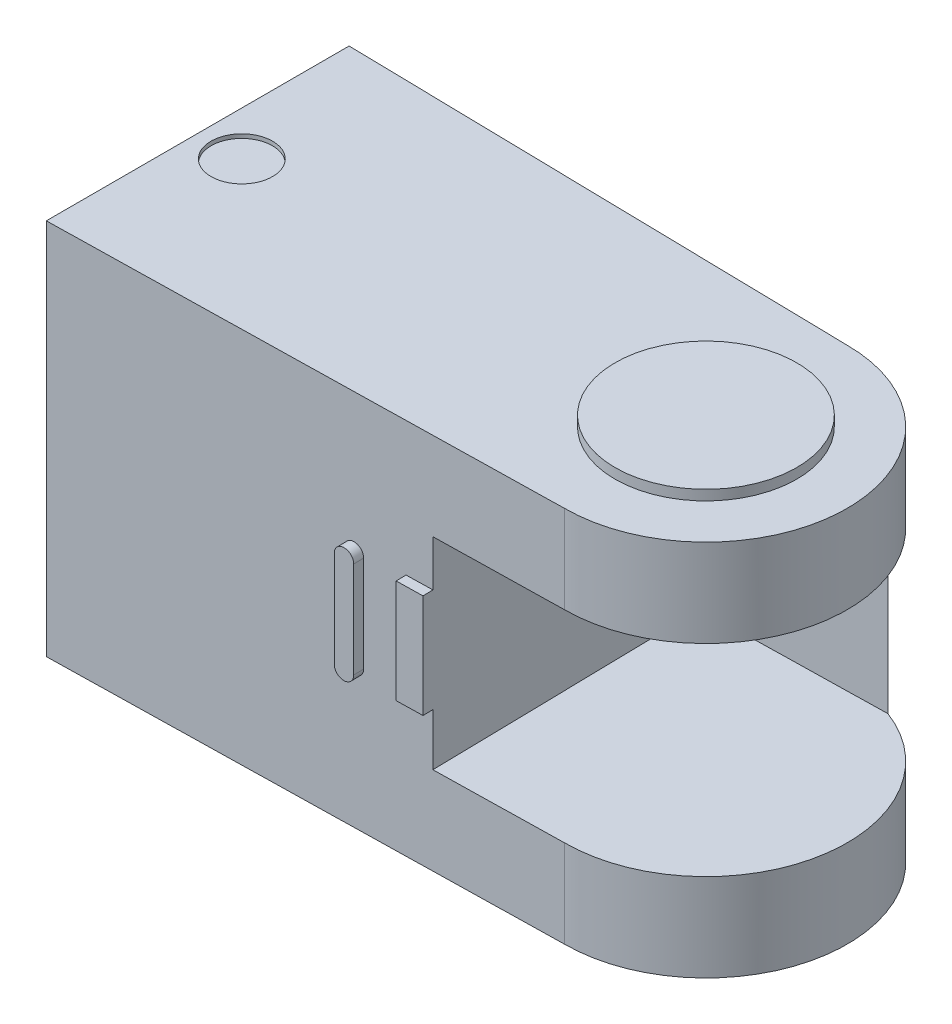
ISO-10303-21;
HEADER;
FILE_DESCRIPTION(('STEP AP214'),'2;1');
FILE_NAME('part.step','',(''),(''),'','','');
FILE_SCHEMA(('AUTOMOTIVE_DESIGN { 1 0 10303 214 1 1 1 1 }'));
ENDSEC;
DATA;
#1=APPLICATION_CONTEXT('core data for automotive mechanical design processes');
#2=APPLICATION_PROTOCOL_DEFINITION('international standard','automotive_design',2000,#1);
#3=PRODUCT_CONTEXT('',#1,'mechanical');
#4=PRODUCT('Part','Part','',(#3));
#5=PRODUCT_RELATED_PRODUCT_CATEGORY('part','',(#4));
#6=PRODUCT_DEFINITION_FORMATION('','',#4);
#7=PRODUCT_DEFINITION_CONTEXT('part definition',#1,'design');
#8=PRODUCT_DEFINITION('design','',#6,#7);
#9=PRODUCT_DEFINITION_SHAPE('','',#8);
#10=(LENGTH_UNIT() NAMED_UNIT(*) SI_UNIT(.MILLI.,.METRE.));
#11=(NAMED_UNIT(*) PLANE_ANGLE_UNIT() SI_UNIT($,.RADIAN.));
#12=(NAMED_UNIT(*) SI_UNIT($,.STERADIAN.) SOLID_ANGLE_UNIT());
#13=UNCERTAINTY_MEASURE_WITH_UNIT(LENGTH_MEASURE(1.E-05),#10,'distance_accuracy_value','');
#14=(GEOMETRIC_REPRESENTATION_CONTEXT(3) GLOBAL_UNCERTAINTY_ASSIGNED_CONTEXT((#13)) GLOBAL_UNIT_ASSIGNED_CONTEXT((#10,
#11,#12)) REPRESENTATION_CONTEXT('',''));
#15=CARTESIAN_POINT('',(0.,0.,0.));
#16=DIRECTION('',(0.,0.,1.));
#17=DIRECTION('',(1.,0.,0.));
#18=AXIS2_PLACEMENT_3D('',#15,#16,#17);
#19=CARTESIAN_POINT('',(-251.76912568306,-187.,75.));
#20=DIRECTION('',(0.0198555493338502,0.,0.999802859148068));
#21=DIRECTION('',(0.999802859148068,0.,-0.0198555493338502));
#22=AXIS2_PLACEMENT_3D('',#19,#20,#21);
#23=PLANE('',#22);
#24=DIRECTION('',(0.,-1.,0.));
#25=VECTOR('',#24,1.);
#26=CARTESIAN_POINT('',(-77.0365294327965,-117.689052856582,71.5299042172823));
#27=LINE('',#26,#25);
#28=CARTESIAN_POINT('',(-77.0365294327965,-66.3433688904558,71.5299042172823));
#29=VERTEX_POINT('',#28);
#30=CARTESIAN_POINT('',(-77.0365294327965,-117.689052856582,71.5299042172823));
#31=VERTEX_POINT('',#30);
#32=EDGE_CURVE('E179',#29,#31,#27,.T.);
#33=ORIENTED_EDGE('',*,*,#32,.F.);
#34=DIRECTION('',(-0.999802859148068,0.,0.01985554933385));
#35=VECTOR('',#34,1.);
#36=CARTESIAN_POINT('',(-63.9873829854763,-66.3433688904558,71.2707551573665));
#37=LINE('',#36,#35);
#38=CARTESIAN_POINT('',(-63.9873829854763,-66.3433688904558,71.2707551573665));
#39=VERTEX_POINT('',#38);
#40=EDGE_CURVE('E177',#39,#29,#37,.T.);
#41=ORIENTED_EDGE('',*,*,#40,.F.);
#42=DIRECTION('',(0.,-1.,0.));
#43=VECTOR('',#42,1.);
#44=CARTESIAN_POINT('',(-63.9873829854763,-43.5,71.2707551573665));
#45=LINE('',#44,#43);
#46=CARTESIAN_POINT('',(-63.9873829854763,-43.5,71.2707551573664));
#47=VERTEX_POINT('',#46);
#48=EDGE_CURVE('E225',#47,#39,#45,.T.);
#49=ORIENTED_EDGE('',*,*,#48,.F.);
#50=DIRECTION('',(-0.999802859148068,0.,0.0198555493338502));
#51=VECTOR('',#50,1.);
#52=CARTESIAN_POINT('',(-251.76912568306,-43.5,75.));
#53=LINE('',#52,#51);
#54=CARTESIAN_POINT('',(0.,-43.5,70.));
#55=VERTEX_POINT('',#54);
#56=EDGE_CURVE('E266',#55,#47,#53,.T.);
#57=ORIENTED_EDGE('',*,*,#56,.F.);
#58=DIRECTION('',(0.,1.,0.));
#59=VECTOR('',#58,1.);
#60=CARTESIAN_POINT('',(0.,-187.,70.));
#61=LINE('',#60,#59);
#62=CARTESIAN_POINT('',(0.,0.,70.));
#63=VERTEX_POINT('',#62);
#64=EDGE_CURVE('E267',#55,#63,#61,.T.);
#65=ORIENTED_EDGE('',*,*,#64,.T.);
#66=DIRECTION('',(0.999802859148068,0.,-0.0198555493338502));
#67=VECTOR('',#66,1.);
#68=CARTESIAN_POINT('',(-251.76912568306,0.,75.));
#69=LINE('',#68,#67);
#70=CARTESIAN_POINT('',(-251.76912568306,0.,75.));
#71=VERTEX_POINT('',#70);
#72=EDGE_CURVE('E243',#71,#63,#69,.T.);
#73=ORIENTED_EDGE('',*,*,#72,.F.);
#74=DIRECTION('',(0.,1.,0.));
#75=VECTOR('',#74,1.);
#76=CARTESIAN_POINT('',(-251.76912568306,-187.,75.));
#77=LINE('',#76,#75);
#78=CARTESIAN_POINT('',(-251.76912568306,-187.,75.));
#79=VERTEX_POINT('',#78);
#80=EDGE_CURVE('E268',#79,#71,#77,.T.);
#81=ORIENTED_EDGE('',*,*,#80,.F.);
#82=DIRECTION('',(0.999802859148068,0.,-0.0198555493338502));
#83=VECTOR('',#82,1.);
#84=CARTESIAN_POINT('',(-251.76912568306,-187.,75.));
#85=LINE('',#84,#83);
#86=CARTESIAN_POINT('',(0.,-187.,70.));
#87=VERTEX_POINT('',#86);
#88=EDGE_CURVE('E249',#79,#87,#85,.T.);
#89=ORIENTED_EDGE('',*,*,#88,.T.);
#90=CARTESIAN_POINT('',(0.,-143.5,70.));
#91=VERTEX_POINT('',#90);
#92=EDGE_CURVE('E263',#87,#91,#61,.T.);
#93=ORIENTED_EDGE('',*,*,#92,.T.);
#94=DIRECTION('',(0.999802859148068,0.,-0.0198555493338502));
#95=VECTOR('',#94,1.);
#96=CARTESIAN_POINT('',(170.633265180487,-143.5,66.6113147369132));
#97=LINE('',#96,#95);
#98=CARTESIAN_POINT('',(-63.9873829854763,-143.5,71.2707551573665));
#99=VERTEX_POINT('',#98);
#100=EDGE_CURVE('E218',#99,#91,#97,.T.);
#101=ORIENTED_EDGE('',*,*,#100,.F.);
#102=CARTESIAN_POINT('',(-63.9873829854763,-117.689052856582,71.2707551573665));
#103=VERTEX_POINT('',#102);
#104=EDGE_CURVE('E212',#103,#99,#45,.T.);
#105=ORIENTED_EDGE('',*,*,#104,.F.);
#106=DIRECTION('',(0.999802859148068,0.,-0.01985554933385));
#107=VECTOR('',#106,1.);
#108=CARTESIAN_POINT('',(-63.9873829854763,-117.689052856582,71.2707551573665));
#109=LINE('',#108,#107);
#110=EDGE_CURVE('E188',#31,#103,#109,.T.);
#111=ORIENTED_EDGE('',*,*,#110,.F.);
#112=EDGE_LOOP('',(#33,#41,#49,#57,#65,#73,#81,#89,#93,#101,#105,#111));
#113=FACE_BOUND('',#112,.T.);
#114=DIRECTION('',(0.,1.,0.));
#115=VECTOR('',#114,1.);
#116=CARTESIAN_POINT('',(-97.6313826815124,-116.79953134356,71.9389069731373));
#117=LINE('',#116,#115);
#118=CARTESIAN_POINT('',(-97.6313826815124,-116.79953134356,71.9389069731373));
#119=VERTEX_POINT('',#118);
#120=CARTESIAN_POINT('',(-97.6313826815124,-69.1725088953774,71.9389069731373));
#121=VERTEX_POINT('',#120);
#122=EDGE_CURVE('E493',#119,#121,#117,.T.);
#123=ORIENTED_EDGE('',*,*,#122,.F.);
#124=CARTESIAN_POINT('',(-102.364306679185,-116.79953134356,72.0329003089928));
#125=DIRECTION('',(0.0198555493338503,0.,0.999802859148068));
#126=DIRECTION('',(0.999802859148068,0.,-0.0198555493338503));
#127=AXIS2_PLACEMENT_3D('',#124,#125,#126);
#128=CIRCLE('',#127,4.73385723432074);
#129=CARTESIAN_POINT('',(-107.097230676858,-116.79953134356,72.1268936448482));
#130=VERTEX_POINT('',#129);
#131=EDGE_CURVE('E175',#130,#119,#128,.T.);
#132=ORIENTED_EDGE('',*,*,#131,.F.);
#133=DIRECTION('',(0.,-1.,0.));
#134=VECTOR('',#133,1.);
#135=CARTESIAN_POINT('',(-107.097230676858,-116.79953134356,72.1268936448482));
#136=LINE('',#135,#134);
#137=CARTESIAN_POINT('',(-107.097230676858,-69.1725088953774,72.1268936448482));
#138=VERTEX_POINT('',#137);
#139=EDGE_CURVE('E171',#138,#130,#136,.T.);
#140=ORIENTED_EDGE('',*,*,#139,.F.);
#141=CARTESIAN_POINT('',(-102.364306679185,-69.1725088953774,72.0329003089928));
#142=DIRECTION('',(0.0198555493338503,0.,0.999802859148068));
#143=DIRECTION('',(0.999802859148068,0.,-0.0198555493338503));
#144=AXIS2_PLACEMENT_3D('',#141,#142,#143);
#145=CIRCLE('',#144,4.73385723432074);
#146=EDGE_CURVE('E502',#121,#138,#145,.T.);
#147=ORIENTED_EDGE('',*,*,#146,.F.);
#148=EDGE_LOOP('',(#123,#132,#140,#147));
#149=FACE_BOUND('',#148,.T.);
#150=ADVANCED_FACE('F38',(#113,#149),#23,.T.);
#151=CARTESIAN_POINT('',(0.,-187.,0.));
#152=DIRECTION('',(0.,1.,0.));
#153=DIRECTION('',(0.,0.,1.));
#154=AXIS2_PLACEMENT_3D('',#151,#152,#153);
#155=CYLINDRICAL_SURFACE('',#154,70.);
#156=CARTESIAN_POINT('',(0.,-143.5,0.));
#157=DIRECTION('',(0.,-1.,0.));
#158=DIRECTION('',(0.,0.,-1.));
#159=AXIS2_PLACEMENT_3D('',#156,#157,#158);
#160=CIRCLE('',#159,70.);
#161=CARTESIAN_POINT('',(24.6502105099139,-143.5,-65.5161592419529));
#162=VERTEX_POINT('',#161);
#163=EDGE_CURVE('E233',#91,#162,#160,.F.);
#164=ORIENTED_EDGE('',*,*,#163,.F.);
#165=ORIENTED_EDGE('',*,*,#92,.F.);
#166=CARTESIAN_POINT('',(0.,-187.,0.));
#167=DIRECTION('',(0.,1.,0.));
#168=DIRECTION('',(0.,0.,1.));
#169=AXIS2_PLACEMENT_3D('',#166,#167,#168);
#170=CIRCLE('',#169,70.);
#171=CARTESIAN_POINT('',(0.,-187.,-70.));
#172=VERTEX_POINT('',#171);
#173=EDGE_CURVE('E239',#87,#172,#170,.T.);
#174=ORIENTED_EDGE('',*,*,#173,.T.);
#175=DIRECTION('',(0.,1.,0.));
#176=VECTOR('',#175,1.);
#177=CARTESIAN_POINT('',(0.,-187.,-70.));
#178=LINE('',#177,#176);
#179=CARTESIAN_POINT('',(0.,0.,-70.));
#180=VERTEX_POINT('',#179);
#181=EDGE_CURVE('E252',#172,#180,#178,.T.);
#182=ORIENTED_EDGE('',*,*,#181,.T.);
#183=CARTESIAN_POINT('',(0.,0.,0.));
#184=DIRECTION('',(0.,1.,0.));
#185=DIRECTION('',(0.,0.,1.));
#186=AXIS2_PLACEMENT_3D('',#183,#184,#185);
#187=CIRCLE('',#186,70.);
#188=EDGE_CURVE('E238',#63,#180,#187,.T.);
#189=ORIENTED_EDGE('',*,*,#188,.F.);
#190=ORIENTED_EDGE('',*,*,#64,.F.);
#191=CARTESIAN_POINT('',(0.,-43.5,0.));
#192=DIRECTION('',(0.,1.,0.));
#193=DIRECTION('',(0.,0.,1.));
#194=AXIS2_PLACEMENT_3D('',#191,#192,#193);
#195=CIRCLE('',#194,70.);
#196=CARTESIAN_POINT('',(24.6502105099139,-43.5,-65.5161592419529));
#197=VERTEX_POINT('',#196);
#198=EDGE_CURVE('E236',#197,#55,#195,.F.);
#199=ORIENTED_EDGE('',*,*,#198,.F.);
#200=DIRECTION('',(0.,1.,0.));
#201=VECTOR('',#200,1.);
#202=CARTESIAN_POINT('',(24.6502105099139,-187.,-65.5161592419529));
#203=LINE('',#202,#201);
#204=EDGE_CURVE('E46',#197,#162,#203,.F.);
#205=ORIENTED_EDGE('',*,*,#204,.T.);
#206=EDGE_LOOP('',(#164,#165,#174,#182,#189,#190,#199,#205));
#207=FACE_BOUND('',#206,.T.);
#208=ADVANCED_FACE('F40',(#207),#155,.T.);
#209=CARTESIAN_POINT('',(-251.76912568306,-187.,-75.));
#210=DIRECTION('',(-1.,0.,0.));
#211=DIRECTION('',(0.,0.,1.));
#212=AXIS2_PLACEMENT_3D('',#209,#210,#211);
#213=PLANE('',#212);
#214=DIRECTION('',(0.,0.,1.));
#215=VECTOR('',#214,1.);
#216=CARTESIAN_POINT('',(-251.76912568306,0.,-75.));
#217=LINE('',#216,#215);
#218=CARTESIAN_POINT('',(-251.76912568306,0.,-75.));
#219=VERTEX_POINT('',#218);
#220=EDGE_CURVE('E258',#219,#71,#217,.T.);
#221=ORIENTED_EDGE('',*,*,#220,.F.);
#222=DIRECTION('',(0.,1.,0.));
#223=VECTOR('',#222,1.);
#224=CARTESIAN_POINT('',(-251.76912568306,-187.,-75.));
#225=LINE('',#224,#223);
#226=CARTESIAN_POINT('',(-251.76912568306,-187.,-75.));
#227=VERTEX_POINT('',#226);
#228=EDGE_CURVE('E270',#227,#219,#225,.T.);
#229=ORIENTED_EDGE('',*,*,#228,.F.);
#230=DIRECTION('',(0.,0.,1.));
#231=VECTOR('',#230,1.);
#232=CARTESIAN_POINT('',(-251.76912568306,-187.,-75.));
#233=LINE('',#232,#231);
#234=EDGE_CURVE('E246',#227,#79,#233,.T.);
#235=ORIENTED_EDGE('',*,*,#234,.T.);
#236=ORIENTED_EDGE('',*,*,#80,.T.);
#237=EDGE_LOOP('',(#221,#229,#235,#236));
#238=FACE_BOUND('',#237,.T.);
#239=ADVANCED_FACE('F339',(#238),#213,.T.);
#240=CARTESIAN_POINT('',(0.,-187.,-70.));
#241=DIRECTION('',(0.01985554933385,0.,-0.999802859148068));
#242=DIRECTION('',(-0.999802859148068,0.,-0.01985554933385));
#243=AXIS2_PLACEMENT_3D('',#240,#241,#242);
#244=PLANE('',#243);
#245=DIRECTION('',(-0.999802859148068,0.,-0.01985554933385));
#246=VECTOR('',#245,1.);
#247=CARTESIAN_POINT('',(0.,0.,-70.));
#248=LINE('',#247,#246);
#249=EDGE_CURVE('E255',#180,#219,#248,.T.);
#250=ORIENTED_EDGE('',*,*,#249,.F.);
#251=ORIENTED_EDGE('',*,*,#181,.F.);
#252=DIRECTION('',(-0.999802859148068,0.,-0.01985554933385));
#253=VECTOR('',#252,1.);
#254=CARTESIAN_POINT('',(0.,-187.,-70.));
#255=LINE('',#254,#253);
#256=EDGE_CURVE('E242',#172,#227,#255,.T.);
#257=ORIENTED_EDGE('',*,*,#256,.T.);
#258=ORIENTED_EDGE('',*,*,#228,.T.);
#259=EDGE_LOOP('',(#250,#251,#257,#258));
#260=FACE_BOUND('',#259,.T.);
#261=ADVANCED_FACE('F304',(#260),#244,.T.);
#262=CARTESIAN_POINT('',(0.,-187.,0.));
#263=DIRECTION('',(0.,1.,0.));
#264=DIRECTION('',(0.,0.,1.));
#265=AXIS2_PLACEMENT_3D('',#262,#263,#264);
#266=PLANE('',#265);
#267=CARTESIAN_POINT('',(0.,-187.,0.));
#268=DIRECTION('',(0.,1.,0.));
#269=DIRECTION('',(0.,0.,1.));
#270=AXIS2_PLACEMENT_3D('',#267,#268,#269);
#271=CIRCLE('',#270,45.);
#272=CARTESIAN_POINT('',(0.,-187.,45.));
#273=VERTEX_POINT('',#272);
#274=EDGE_CURVE('E11',#273,#273,#271,.F.);
#275=ORIENTED_EDGE('',*,*,#274,.F.);
#276=EDGE_LOOP('',(#275));
#277=FACE_BOUND('',#276,.T.);
#278=ORIENTED_EDGE('',*,*,#173,.F.);
#279=ORIENTED_EDGE('',*,*,#88,.F.);
#280=ORIENTED_EDGE('',*,*,#234,.F.);
#281=ORIENTED_EDGE('',*,*,#256,.F.);
#282=EDGE_LOOP('',(#278,#279,#280,#281));
#283=FACE_BOUND('',#282,.T.);
#284=ADVANCED_FACE('F300',(#277,#283),#266,.F.);
#285=CARTESIAN_POINT('',(0.,0.,0.));
#286=DIRECTION('',(0.,1.,0.));
#287=DIRECTION('',(0.,0.,1.));
#288=AXIS2_PLACEMENT_3D('',#285,#286,#287);
#289=PLANE('',#288);
#290=CARTESIAN_POINT('',(-229.928260901961,0.,0.));
#291=DIRECTION('',(0.,1.,0.));
#292=DIRECTION('',(0.,0.,1.));
#293=AXIS2_PLACEMENT_3D('',#290,#291,#292);
#294=CIRCLE('',#293,15.225);
#295=CARTESIAN_POINT('',(-229.928260901961,0.,15.225));
#296=VERTEX_POINT('',#295);
#297=EDGE_CURVE('E491',#296,#296,#294,.T.);
#298=ORIENTED_EDGE('',*,*,#297,.F.);
#299=EDGE_LOOP('',(#298));
#300=FACE_BOUND('',#299,.T.);
#301=CARTESIAN_POINT('',(0.,0.,0.));
#302=DIRECTION('',(0.,1.,0.));
#303=DIRECTION('',(0.,0.,1.));
#304=AXIS2_PLACEMENT_3D('',#301,#302,#303);
#305=CIRCLE('',#304,45.);
#306=CARTESIAN_POINT('',(0.,0.,45.));
#307=VERTEX_POINT('',#306);
#308=EDGE_CURVE('E208',#307,#307,#305,.T.);
#309=ORIENTED_EDGE('',*,*,#308,.F.);
#310=EDGE_LOOP('',(#309));
#311=FACE_BOUND('',#310,.T.);
#312=ORIENTED_EDGE('',*,*,#188,.T.);
#313=ORIENTED_EDGE('',*,*,#249,.T.);
#314=ORIENTED_EDGE('',*,*,#220,.T.);
#315=ORIENTED_EDGE('',*,*,#72,.T.);
#316=EDGE_LOOP('',(#312,#313,#314,#315));
#317=FACE_BOUND('',#316,.T.);
#318=ADVANCED_FACE('F309',(#300,#311,#317),#289,.T.);
#319=CARTESIAN_POINT('',(-2.68049916006978,-43.5,-64.9733859849891));
#320=DIRECTION('',(0.,1.,0.));
#321=DIRECTION('',(0.,0.,1.));
#322=AXIS2_PLACEMENT_3D('',#319,#320,#321);
#323=PLANE('',#322);
#324=ORIENTED_EDGE('',*,*,#198,.T.);
#325=ORIENTED_EDGE('',*,*,#56,.T.);
#326=DIRECTION('',(0.0198555493338503,0.,0.999802859148068));
#327=VECTOR('',#326,1.);
#328=CARTESIAN_POINT('',(-66.6678821455461,-43.5,-63.7026308276227));
#329=LINE('',#328,#327);
#330=CARTESIAN_POINT('',(-66.6678821455461,-43.5,-63.7026308276227));
#331=VERTEX_POINT('',#330);
#332=EDGE_CURVE('E224',#331,#47,#329,.T.);
#333=ORIENTED_EDGE('',*,*,#332,.F.);
#334=DIRECTION('',(-0.999802859148068,0.,0.0198555493338502));
#335=VECTOR('',#334,1.);
#336=CARTESIAN_POINT('',(-2.68049916006978,-43.5,-64.9733859849891));
#337=LINE('',#336,#335);
#338=EDGE_CURVE('E215',#197,#331,#337,.T.);
#339=ORIENTED_EDGE('',*,*,#338,.F.);
#340=EDGE_LOOP('',(#324,#325,#333,#339));
#341=FACE_BOUND('',#340,.T.);
#342=ADVANCED_FACE('F284',(#341),#323,.F.);
#343=CARTESIAN_POINT('',(167.952766020417,-143.5,-68.3620712480759));
#344=DIRECTION('',(0.,-1.,0.));
#345=DIRECTION('',(0.,0.,-1.));
#346=AXIS2_PLACEMENT_3D('',#343,#344,#345);
#347=PLANE('',#346);
#348=ORIENTED_EDGE('',*,*,#163,.T.);
#349=DIRECTION('',(0.999802859148068,0.,-0.0198555493338502));
#350=VECTOR('',#349,1.);
#351=CARTESIAN_POINT('',(-2.68049916006977,-143.5,-64.9733859849891));
#352=LINE('',#351,#350);
#353=CARTESIAN_POINT('',(-66.6678821455461,-143.5,-63.7026308276227));
#354=VERTEX_POINT('',#353);
#355=EDGE_CURVE('E221',#354,#162,#352,.T.);
#356=ORIENTED_EDGE('',*,*,#355,.F.);
#357=DIRECTION('',(0.0198555493338503,0.,0.999802859148068));
#358=VECTOR('',#357,1.);
#359=CARTESIAN_POINT('',(-66.6678821455461,-143.5,-63.7026308276227));
#360=LINE('',#359,#358);
#361=EDGE_CURVE('E230',#354,#99,#360,.T.);
#362=ORIENTED_EDGE('',*,*,#361,.T.);
#363=ORIENTED_EDGE('',*,*,#100,.T.);
#364=EDGE_LOOP('',(#348,#356,#362,#363));
#365=FACE_BOUND('',#364,.T.);
#366=ADVANCED_FACE('F292',(#365),#347,.F.);
#367=CARTESIAN_POINT('',(-66.6678821455461,-43.5,-63.7026308276227));
#368=DIRECTION('',(-0.999802859148068,0.,0.0198555493338503));
#369=DIRECTION('',(0.0198555493338503,0.,0.999802859148068));
#370=AXIS2_PLACEMENT_3D('',#367,#368,#369);
#371=PLANE('',#370);
#372=ORIENTED_EDGE('',*,*,#48,.T.);
#373=DIRECTION('',(-0.0198555493338502,0.,-0.999802859148068));
#374=VECTOR('',#373,1.);
#375=CARTESIAN_POINT('',(-63.888105238807,-66.3433688904558,76.2697694531068));
#376=LINE('',#375,#374);
#377=CARTESIAN_POINT('',(-63.888105238807,-66.3433688904558,76.2697694531068));
#378=VERTEX_POINT('',#377);
#379=EDGE_CURVE('E203',#378,#39,#376,.T.);
#380=ORIENTED_EDGE('',*,*,#379,.F.);
#381=DIRECTION('',(0.,1.,0.));
#382=VECTOR('',#381,1.);
#383=CARTESIAN_POINT('',(-63.888105238807,-117.689052856582,76.2697694531068));
#384=LINE('',#383,#382);
#385=CARTESIAN_POINT('',(-63.888105238807,-117.689052856582,76.2697694531068));
#386=VERTEX_POINT('',#385);
#387=EDGE_CURVE('E184',#386,#378,#384,.T.);
#388=ORIENTED_EDGE('',*,*,#387,.F.);
#389=DIRECTION('',(-0.0198555493338502,0.,-0.999802859148068));
#390=VECTOR('',#389,1.);
#391=CARTESIAN_POINT('',(-63.888105238807,-117.689052856582,76.2697694531068));
#392=LINE('',#391,#390);
#393=EDGE_CURVE('E61',#386,#103,#392,.T.);
#394=ORIENTED_EDGE('',*,*,#393,.T.);
#395=ORIENTED_EDGE('',*,*,#104,.T.);
#396=ORIENTED_EDGE('',*,*,#361,.F.);
#397=DIRECTION('',(0.,-1.,0.));
#398=VECTOR('',#397,1.);
#399=CARTESIAN_POINT('',(-66.6678821455461,-43.5,-63.7026308276227));
#400=LINE('',#399,#398);
#401=EDGE_CURVE('E217',#331,#354,#400,.T.);
#402=ORIENTED_EDGE('',*,*,#401,.F.);
#403=ORIENTED_EDGE('',*,*,#332,.T.);
#404=EDGE_LOOP('',(#372,#380,#388,#394,#395,#396,#402,#403));
#405=FACE_BOUND('',#404,.T.);
#406=ADVANCED_FACE('F288',(#405),#371,.F.);
#407=CARTESIAN_POINT('',(-1.29088471049406,0.,-65.0009829837436));
#408=DIRECTION('',(0.0198555493338502,0.,0.999802859148068));
#409=DIRECTION('',(0.999802859148068,0.,-0.0198555493338502));
#410=AXIS2_PLACEMENT_3D('',#407,#408,#409);
#411=PLANE('',#410);
#412=ORIENTED_EDGE('',*,*,#338,.T.);
#413=ORIENTED_EDGE('',*,*,#401,.T.);
#414=ORIENTED_EDGE('',*,*,#355,.T.);
#415=ORIENTED_EDGE('',*,*,#204,.F.);
#416=EDGE_LOOP('',(#412,#413,#414,#415));
#417=FACE_BOUND('',#416,.T.);
#418=ADVANCED_FACE('F280',(#417),#411,.T.);
#419=CARTESIAN_POINT('',(0.,5.,0.));
#420=DIRECTION('',(0.,-1.,0.));
#421=DIRECTION('',(0.,0.,-1.));
#422=AXIS2_PLACEMENT_3D('',#419,#420,#421);
#423=CYLINDRICAL_SURFACE('',#422,45.);
#424=CARTESIAN_POINT('',(0.,5.,0.));
#425=DIRECTION('',(0.,1.,0.));
#426=DIRECTION('',(0.,0.,1.));
#427=AXIS2_PLACEMENT_3D('',#424,#425,#426);
#428=CIRCLE('',#427,45.);
#429=CARTESIAN_POINT('',(0.,5.,45.));
#430=VERTEX_POINT('',#429);
#431=EDGE_CURVE('E209',#430,#430,#428,.T.);
#432=ORIENTED_EDGE('',*,*,#431,.F.);
#433=EDGE_LOOP('',(#432));
#434=FACE_BOUND('',#433,.T.);
#435=ORIENTED_EDGE('',*,*,#308,.T.);
#436=EDGE_LOOP('',(#435));
#437=FACE_BOUND('',#436,.T.);
#438=ADVANCED_FACE('F364',(#434,#437),#423,.T.);
#439=CARTESIAN_POINT('',(0.,5.,0.));
#440=DIRECTION('',(0.,1.,0.));
#441=DIRECTION('',(0.,0.,1.));
#442=AXIS2_PLACEMENT_3D('',#439,#440,#441);
#443=PLANE('',#442);
#444=ORIENTED_EDGE('',*,*,#431,.T.);
#445=EDGE_LOOP('',(#444));
#446=FACE_BOUND('',#445,.T.);
#447=ADVANCED_FACE('F367',(#446),#443,.T.);
#448=CARTESIAN_POINT('',(0.,-192.,0.));
#449=DIRECTION('',(0.,1.,0.));
#450=DIRECTION('',(0.,0.,1.));
#451=AXIS2_PLACEMENT_3D('',#448,#449,#450);
#452=CYLINDRICAL_SURFACE('',#451,45.);
#453=CARTESIAN_POINT('',(0.,-192.,0.));
#454=DIRECTION('',(0.,-1.,0.));
#455=DIRECTION('',(0.,0.,-1.));
#456=AXIS2_PLACEMENT_3D('',#453,#454,#455);
#457=CIRCLE('',#456,45.);
#458=CARTESIAN_POINT('',(0.,-192.,-45.));
#459=VERTEX_POINT('',#458);
#460=EDGE_CURVE('E205',#459,#459,#457,.T.);
#461=ORIENTED_EDGE('',*,*,#460,.F.);
#462=EDGE_LOOP('',(#461));
#463=FACE_BOUND('',#462,.T.);
#464=ORIENTED_EDGE('',*,*,#274,.T.);
#465=EDGE_LOOP('',(#464));
#466=FACE_BOUND('',#465,.T.);
#467=ADVANCED_FACE('F371',(#463,#466),#452,.T.);
#468=CARTESIAN_POINT('',(0.,-192.,0.));
#469=DIRECTION('',(0.,-1.,0.));
#470=DIRECTION('',(0.,0.,-1.));
#471=AXIS2_PLACEMENT_3D('',#468,#469,#470);
#472=PLANE('',#471);
#473=ORIENTED_EDGE('',*,*,#460,.T.);
#474=EDGE_LOOP('',(#473));
#475=FACE_BOUND('',#474,.T.);
#476=ADVANCED_FACE('F332',(#475),#472,.T.);
#477=CARTESIAN_POINT('',(-63.888105238807,-66.3433688904558,76.2697694531068));
#478=DIRECTION('',(0.,-1.,0.));
#479=DIRECTION('',(0.,0.,-1.));
#480=AXIS2_PLACEMENT_3D('',#477,#478,#479);
#481=PLANE('',#480);
#482=ORIENTED_EDGE('',*,*,#40,.T.);
#483=DIRECTION('',(-0.0198555493338502,0.,-0.999802859148068));
#484=VECTOR('',#483,1.);
#485=CARTESIAN_POINT('',(-76.9372516861273,-66.3433688904558,76.5289185130227));
#486=LINE('',#485,#484);
#487=CARTESIAN_POINT('',(-76.9372516861273,-66.3433688904558,76.5289185130227));
#488=VERTEX_POINT('',#487);
#489=EDGE_CURVE('E200',#488,#29,#486,.T.);
#490=ORIENTED_EDGE('',*,*,#489,.F.);
#491=DIRECTION('',(-0.999802859148068,0.,0.01985554933385));
#492=VECTOR('',#491,1.);
#493=CARTESIAN_POINT('',(-63.888105238807,-66.3433688904558,76.2697694531068));
#494=LINE('',#493,#492);
#495=EDGE_CURVE('E187',#378,#488,#494,.T.);
#496=ORIENTED_EDGE('',*,*,#495,.F.);
#497=ORIENTED_EDGE('',*,*,#379,.T.);
#498=EDGE_LOOP('',(#482,#490,#496,#497));
#499=FACE_BOUND('',#498,.T.);
#500=ADVANCED_FACE('F313',(#499),#481,.F.);
#501=CARTESIAN_POINT('',(-76.9372516861273,-117.689052856582,76.5289185130227));
#502=DIRECTION('',(0.999802859148068,0.,-0.0198555493338502));
#503=DIRECTION('',(-0.0198555493338502,0.,-0.999802859148068));
#504=AXIS2_PLACEMENT_3D('',#501,#502,#503);
#505=PLANE('',#504);
#506=ORIENTED_EDGE('',*,*,#32,.T.);
#507=DIRECTION('',(-0.0198555493338502,0.,-0.999802859148068));
#508=VECTOR('',#507,1.);
#509=CARTESIAN_POINT('',(-76.9372516861273,-117.689052856582,76.5289185130227));
#510=LINE('',#509,#508);
#511=CARTESIAN_POINT('',(-76.9372516861273,-117.689052856582,76.5289185130227));
#512=VERTEX_POINT('',#511);
#513=EDGE_CURVE('E197',#512,#31,#510,.T.);
#514=ORIENTED_EDGE('',*,*,#513,.F.);
#515=DIRECTION('',(0.,-1.,0.));
#516=VECTOR('',#515,1.);
#517=CARTESIAN_POINT('',(-76.9372516861273,-117.689052856582,76.5289185130227));
#518=LINE('',#517,#516);
#519=EDGE_CURVE('E190',#488,#512,#518,.T.);
#520=ORIENTED_EDGE('',*,*,#519,.F.);
#521=ORIENTED_EDGE('',*,*,#489,.T.);
#522=EDGE_LOOP('',(#506,#514,#520,#521));
#523=FACE_BOUND('',#522,.T.);
#524=ADVANCED_FACE('F324',(#523),#505,.F.);
#525=CARTESIAN_POINT('',(-63.888105238807,-117.689052856582,76.2697694531068));
#526=DIRECTION('',(0.,1.,0.));
#527=DIRECTION('',(0.,0.,1.));
#528=AXIS2_PLACEMENT_3D('',#525,#526,#527);
#529=PLANE('',#528);
#530=ORIENTED_EDGE('',*,*,#110,.T.);
#531=ORIENTED_EDGE('',*,*,#393,.F.);
#532=DIRECTION('',(0.999802859148068,0.,-0.01985554933385));
#533=VECTOR('',#532,1.);
#534=CARTESIAN_POINT('',(-63.888105238807,-117.689052856582,76.2697694531068));
#535=LINE('',#534,#533);
#536=EDGE_CURVE('E192',#512,#386,#535,.T.);
#537=ORIENTED_EDGE('',*,*,#536,.F.);
#538=ORIENTED_EDGE('',*,*,#513,.T.);
#539=EDGE_LOOP('',(#530,#531,#537,#538));
#540=FACE_BOUND('',#539,.T.);
#541=ADVANCED_FACE('F321',(#540),#529,.F.);
#542=CARTESIAN_POINT('',(1.48889219624497,0.,74.971417296986));
#543=DIRECTION('',(0.01985554933385,0.,0.999802859148068));
#544=DIRECTION('',(0.999802859148068,0.,-0.01985554933385));
#545=AXIS2_PLACEMENT_3D('',#542,#543,#544);
#546=PLANE('',#545);
#547=ORIENTED_EDGE('',*,*,#387,.T.);
#548=ORIENTED_EDGE('',*,*,#495,.T.);
#549=ORIENTED_EDGE('',*,*,#519,.T.);
#550=ORIENTED_EDGE('',*,*,#536,.T.);
#551=EDGE_LOOP('',(#547,#548,#549,#550));
#552=FACE_BOUND('',#551,.T.);
#553=ADVANCED_FACE('F317',(#552),#546,.T.);
#554=CARTESIAN_POINT('',(-102.265028932516,-116.79953134356,77.0319146047331));
#555=DIRECTION('',(-0.0198555493338502,0.,-0.999802859148068));
#556=DIRECTION('',(-0.999802859148068,0.,0.0198555493338502));
#557=AXIS2_PLACEMENT_3D('',#554,#555,#556);
#558=CYLINDRICAL_SURFACE('',#557,4.73385723432074);
#559=ORIENTED_EDGE('',*,*,#131,.T.);
#560=DIRECTION('',(-0.0198555493338502,0.,-0.999802859148068));
#561=VECTOR('',#560,1.);
#562=CARTESIAN_POINT('',(-97.5321049348431,-116.79953134356,76.9379212688777));
#563=LINE('',#562,#561);
#564=CARTESIAN_POINT('',(-97.5321049348431,-116.79953134356,76.9379212688777));
#565=VERTEX_POINT('',#564);
#566=EDGE_CURVE('E156',#565,#119,#563,.T.);
#567=ORIENTED_EDGE('',*,*,#566,.F.);
#568=CARTESIAN_POINT('',(-102.265028932516,-116.79953134356,77.0319146047331));
#569=DIRECTION('',(0.0198555493338503,0.,0.999802859148068));
#570=DIRECTION('',(0.999802859148068,0.,-0.0198555493338503));
#571=AXIS2_PLACEMENT_3D('',#568,#569,#570);
#572=CIRCLE('',#571,4.73385723432074);
#573=CARTESIAN_POINT('',(-106.997952930188,-116.79953134356,77.1259079405886));
#574=VERTEX_POINT('',#573);
#575=EDGE_CURVE('E163',#574,#565,#572,.T.);
#576=ORIENTED_EDGE('',*,*,#575,.F.);
#577=DIRECTION('',(-0.0198555493338502,0.,-0.999802859148068));
#578=VECTOR('',#577,1.);
#579=CARTESIAN_POINT('',(-106.997952930188,-116.79953134356,77.1259079405886));
#580=LINE('',#579,#578);
#581=EDGE_CURVE('E499',#574,#130,#580,.T.);
#582=ORIENTED_EDGE('',*,*,#581,.T.);
#583=EDGE_LOOP('',(#559,#567,#576,#582));
#584=FACE_BOUND('',#583,.T.);
#585=ADVANCED_FACE('F173',(#584),#558,.T.);
#586=CARTESIAN_POINT('',(-97.5321049348431,-116.79953134356,76.9379212688777));
#587=DIRECTION('',(-0.999802859148068,0.,0.0198555493338502));
#588=DIRECTION('',(0.0198555493338502,0.,0.999802859148068));
#589=AXIS2_PLACEMENT_3D('',#586,#587,#588);
#590=PLANE('',#589);
#591=ORIENTED_EDGE('',*,*,#122,.T.);
#592=DIRECTION('',(-0.0198555493338502,0.,-0.999802859148068));
#593=VECTOR('',#592,1.);
#594=CARTESIAN_POINT('',(-97.5321049348431,-69.1725088953774,76.9379212688777));
#595=LINE('',#594,#593);
#596=CARTESIAN_POINT('',(-97.5321049348431,-69.1725088953774,76.9379212688777));
#597=VERTEX_POINT('',#596);
#598=EDGE_CURVE('E159',#597,#121,#595,.T.);
#599=ORIENTED_EDGE('',*,*,#598,.F.);
#600=DIRECTION('',(0.,1.,0.));
#601=VECTOR('',#600,1.);
#602=CARTESIAN_POINT('',(-97.5321049348431,-116.79953134356,76.9379212688777));
#603=LINE('',#602,#601);
#604=EDGE_CURVE('E152',#565,#597,#603,.T.);
#605=ORIENTED_EDGE('',*,*,#604,.F.);
#606=ORIENTED_EDGE('',*,*,#566,.T.);
#607=EDGE_LOOP('',(#591,#599,#605,#606));
#608=FACE_BOUND('',#607,.T.);
#609=ADVANCED_FACE('F154',(#608),#590,.F.);
#610=CARTESIAN_POINT('',(-102.265028932516,-69.1725088953774,77.0319146047331));
#611=DIRECTION('',(-0.0198555493338502,0.,-0.999802859148068));
#612=DIRECTION('',(-0.999802859148068,0.,0.0198555493338502));
#613=AXIS2_PLACEMENT_3D('',#610,#611,#612);
#614=CYLINDRICAL_SURFACE('',#613,4.73385723432074);
#615=ORIENTED_EDGE('',*,*,#146,.T.);
#616=DIRECTION('',(-0.0198555493338502,0.,-0.999802859148068));
#617=VECTOR('',#616,1.);
#618=CARTESIAN_POINT('',(-106.997952930188,-69.1725088953774,77.1259079405886));
#619=LINE('',#618,#617);
#620=CARTESIAN_POINT('',(-106.997952930188,-69.1725088953774,77.1259079405886));
#621=VERTEX_POINT('',#620);
#622=EDGE_CURVE('E53',#621,#138,#619,.T.);
#623=ORIENTED_EDGE('',*,*,#622,.F.);
#624=CARTESIAN_POINT('',(-102.265028932516,-69.1725088953774,77.0319146047331));
#625=DIRECTION('',(0.0198555493338503,0.,0.999802859148068));
#626=DIRECTION('',(0.999802859148068,0.,-0.0198555493338503));
#627=AXIS2_PLACEMENT_3D('',#624,#625,#626);
#628=CIRCLE('',#627,4.73385723432074);
#629=EDGE_CURVE('E162',#597,#621,#628,.T.);
#630=ORIENTED_EDGE('',*,*,#629,.F.);
#631=ORIENTED_EDGE('',*,*,#598,.T.);
#632=EDGE_LOOP('',(#615,#623,#630,#631));
#633=FACE_BOUND('',#632,.T.);
#634=ADVANCED_FACE('F430',(#633),#614,.T.);
#635=CARTESIAN_POINT('',(-106.997952930188,-116.79953134356,77.1259079405886));
#636=DIRECTION('',(0.999802859148068,0.,-0.0198555493338502));
#637=DIRECTION('',(-0.0198555493338502,0.,-0.999802859148068));
#638=AXIS2_PLACEMENT_3D('',#635,#636,#637);
#639=PLANE('',#638);
#640=ORIENTED_EDGE('',*,*,#139,.T.);
#641=ORIENTED_EDGE('',*,*,#581,.F.);
#642=DIRECTION('',(0.,-1.,0.));
#643=VECTOR('',#642,1.);
#644=CARTESIAN_POINT('',(-106.997952930188,-116.79953134356,77.1259079405886));
#645=LINE('',#644,#643);
#646=EDGE_CURVE('E167',#621,#574,#645,.T.);
#647=ORIENTED_EDGE('',*,*,#646,.F.);
#648=ORIENTED_EDGE('',*,*,#622,.T.);
#649=EDGE_LOOP('',(#640,#641,#647,#648));
#650=FACE_BOUND('',#649,.T.);
#651=ADVANCED_FACE('F439',(#650),#639,.F.);
#652=CARTESIAN_POINT('',(-102.265028932516,-116.79953134356,77.0319146047331));
#653=DIRECTION('',(0.0198555493338503,0.,0.999802859148068));
#654=DIRECTION('',(0.999802859148068,0.,-0.0198555493338503));
#655=AXIS2_PLACEMENT_3D('',#652,#653,#654);
#656=PLANE('',#655);
#657=ORIENTED_EDGE('',*,*,#575,.T.);
#658=ORIENTED_EDGE('',*,*,#604,.T.);
#659=ORIENTED_EDGE('',*,*,#629,.T.);
#660=ORIENTED_EDGE('',*,*,#646,.T.);
#661=EDGE_LOOP('',(#657,#658,#659,#660));
#662=FACE_BOUND('',#661,.T.);
#663=ADVANCED_FACE('F166',(#662),#656,.T.);
#664=CARTESIAN_POINT('',(-229.928260901961,-2.,0.));
#665=DIRECTION('',(0.,1.,0.));
#666=DIRECTION('',(0.,0.,1.));
#667=AXIS2_PLACEMENT_3D('',#664,#665,#666);
#668=CYLINDRICAL_SURFACE('',#667,15.225);
#669=CARTESIAN_POINT('',(-229.928260901961,-2.,0.));
#670=DIRECTION('',(0.,1.,0.));
#671=DIRECTION('',(0.,0.,1.));
#672=AXIS2_PLACEMENT_3D('',#669,#670,#671);
#673=CIRCLE('',#672,15.225);
#674=CARTESIAN_POINT('',(-229.928260901961,-2.,15.225));
#675=VERTEX_POINT('',#674);
#676=EDGE_CURVE('E490',#675,#675,#673,.T.);
#677=ORIENTED_EDGE('',*,*,#676,.F.);
#678=EDGE_LOOP('',(#677));
#679=FACE_BOUND('',#678,.T.);
#680=ORIENTED_EDGE('',*,*,#297,.T.);
#681=EDGE_LOOP('',(#680));
#682=FACE_BOUND('',#681,.T.);
#683=ADVANCED_FACE('F457',(#679,#682),#668,.F.);
#684=CARTESIAN_POINT('',(-229.928260901961,-2.,0.));
#685=DIRECTION('',(0.,1.,0.));
#686=DIRECTION('',(0.,0.,1.));
#687=AXIS2_PLACEMENT_3D('',#684,#685,#686);
#688=PLANE('',#687);
#689=ORIENTED_EDGE('',*,*,#676,.T.);
#690=EDGE_LOOP('',(#689));
#691=FACE_BOUND('',#690,.T.);
#692=ADVANCED_FACE('F474',(#691),#688,.T.);
#693=CLOSED_SHELL('',(#150,#208,#239,#261,#284,#318,#342,#366,#406,#418,#438,#447,#467,#476,
#500,#524,#541,#553,#585,#609,#634,#651,#663,#683,#692));
#694=MANIFOLD_SOLID_BREP('B2',#693);
#695=ADVANCED_BREP_SHAPE_REPRESENTATION('',(#18,#694),#14);
#696=SHAPE_DEFINITION_REPRESENTATION(#9,#695);
ENDSEC;
END-ISO-10303-21;
